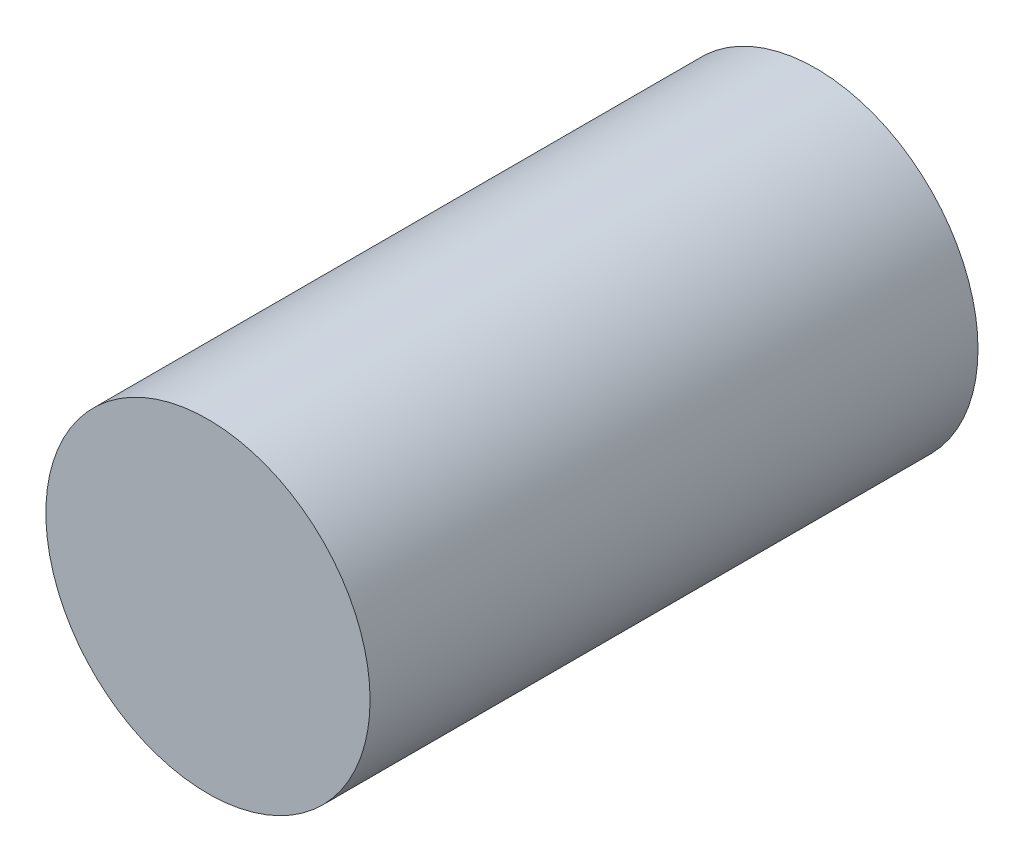
ISO-10303-21;
HEADER;
FILE_DESCRIPTION(('STEP AP214'),'2;1');
FILE_NAME('part.step','',(''),(''),'','','');
FILE_SCHEMA(('AUTOMOTIVE_DESIGN { 1 0 10303 214 1 1 1 1 }'));
ENDSEC;
DATA;
#1=APPLICATION_CONTEXT('core data for automotive mechanical design processes');
#2=APPLICATION_PROTOCOL_DEFINITION('international standard','automotive_design',2000,#1);
#3=PRODUCT_CONTEXT('',#1,'mechanical');
#4=PRODUCT('Part','Part','',(#3));
#5=PRODUCT_RELATED_PRODUCT_CATEGORY('part','',(#4));
#6=PRODUCT_DEFINITION_FORMATION('','',#4);
#7=PRODUCT_DEFINITION_CONTEXT('part definition',#1,'design');
#8=PRODUCT_DEFINITION('design','',#6,#7);
#9=PRODUCT_DEFINITION_SHAPE('','',#8);
#10=(LENGTH_UNIT() NAMED_UNIT(*) SI_UNIT(.MILLI.,.METRE.));
#11=(NAMED_UNIT(*) PLANE_ANGLE_UNIT() SI_UNIT($,.RADIAN.));
#12=(NAMED_UNIT(*) SI_UNIT($,.STERADIAN.) SOLID_ANGLE_UNIT());
#13=UNCERTAINTY_MEASURE_WITH_UNIT(LENGTH_MEASURE(1.E-05),#10,'distance_accuracy_value','');
#14=(GEOMETRIC_REPRESENTATION_CONTEXT(3) GLOBAL_UNCERTAINTY_ASSIGNED_CONTEXT((#13)) GLOBAL_UNIT_ASSIGNED_CONTEXT((#10,
#11,#12)) REPRESENTATION_CONTEXT('',''));
#15=CARTESIAN_POINT('',(0.,0.,0.));
#16=DIRECTION('',(0.,0.,1.));
#17=DIRECTION('',(1.,0.,0.));
#18=AXIS2_PLACEMENT_3D('',#15,#16,#17);
#19=CARTESIAN_POINT('',(0.,0.,0.));
#20=DIRECTION('',(0.,0.,1.));
#21=DIRECTION('',(1.,0.,0.));
#22=AXIS2_PLACEMENT_3D('',#19,#20,#21);
#23=PLANE('',#22);
#24=CARTESIAN_POINT('',(20.,-42.,0.));
#25=DIRECTION('',(0.,0.,1.));
#26=DIRECTION('',(1.,0.,0.));
#27=AXIS2_PLACEMENT_3D('',#24,#25,#26);
#28=CIRCLE('',#27,3.2);
#29=CARTESIAN_POINT('',(23.2,-42.,0.));
#30=VERTEX_POINT('',#29);
#31=EDGE_CURVE('E11',#30,#30,#28,.T.);
#32=ORIENTED_EDGE('',*,*,#31,.F.);
#33=EDGE_LOOP('',(#32));
#34=FACE_BOUND('',#33,.T.);
#35=ADVANCED_FACE('F38',(#34),#23,.F.);
#36=CARTESIAN_POINT('',(20.,-42.,0.));
#37=DIRECTION('',(0.,0.,1.));
#38=DIRECTION('',(1.,0.,0.));
#39=AXIS2_PLACEMENT_3D('',#36,#37,#38);
#40=CYLINDRICAL_SURFACE('',#39,3.2);
#41=ORIENTED_EDGE('',*,*,#31,.T.);
#42=EDGE_LOOP('',(#41));
#43=FACE_BOUND('',#42,.T.);
#44=CARTESIAN_POINT('',(20.,-42.,12.));
#45=DIRECTION('',(0.,0.,1.));
#46=DIRECTION('',(1.,0.,0.));
#47=AXIS2_PLACEMENT_3D('',#44,#45,#46);
#48=CIRCLE('',#47,3.2);
#49=CARTESIAN_POINT('',(23.2,-42.,12.));
#50=VERTEX_POINT('',#49);
#51=EDGE_CURVE('E41',#50,#50,#48,.T.);
#52=ORIENTED_EDGE('',*,*,#51,.F.);
#53=EDGE_LOOP('',(#52));
#54=FACE_BOUND('',#53,.T.);
#55=ADVANCED_FACE('F52',(#43,#54),#40,.T.);
#56=CARTESIAN_POINT('',(0.,0.,12.));
#57=DIRECTION('',(0.,0.,1.));
#58=DIRECTION('',(1.,0.,0.));
#59=AXIS2_PLACEMENT_3D('',#56,#57,#58);
#60=PLANE('',#59);
#61=ORIENTED_EDGE('',*,*,#51,.T.);
#62=EDGE_LOOP('',(#61));
#63=FACE_BOUND('',#62,.T.);
#64=ADVANCED_FACE('F50',(#63),#60,.T.);
#65=CLOSED_SHELL('',(#35,#55,#64));
#66=MANIFOLD_SOLID_BREP('B2',#65);
#67=ADVANCED_BREP_SHAPE_REPRESENTATION('',(#18,#66),#14);
#68=SHAPE_DEFINITION_REPRESENTATION(#9,#67);
ENDSEC;
END-ISO-10303-21;
